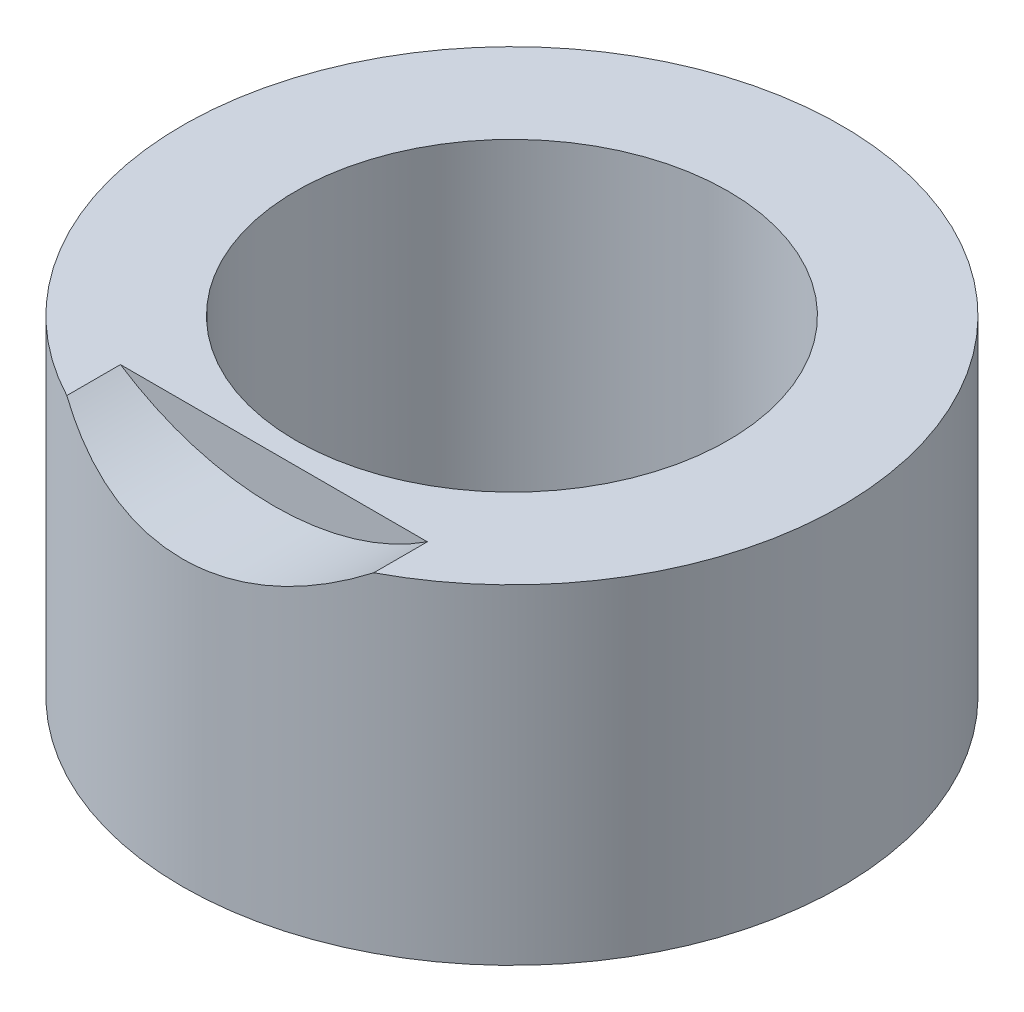
ISO-10303-21;
HEADER;
FILE_DESCRIPTION(('STEP AP214'),'2;1');
FILE_NAME('part.step','',(''),(''),'','','');
FILE_SCHEMA(('AUTOMOTIVE_DESIGN { 1 0 10303 214 1 1 1 1 }'));
ENDSEC;
DATA;
#1=APPLICATION_CONTEXT('core data for automotive mechanical design processes');
#2=APPLICATION_PROTOCOL_DEFINITION('international standard','automotive_design',2000,#1);
#3=PRODUCT_CONTEXT('',#1,'mechanical');
#4=PRODUCT('Part','Part','',(#3));
#5=PRODUCT_RELATED_PRODUCT_CATEGORY('part','',(#4));
#6=PRODUCT_DEFINITION_FORMATION('','',#4);
#7=PRODUCT_DEFINITION_CONTEXT('part definition',#1,'design');
#8=PRODUCT_DEFINITION('design','',#6,#7);
#9=PRODUCT_DEFINITION_SHAPE('','',#8);
#10=(LENGTH_UNIT() NAMED_UNIT(*) SI_UNIT(.MILLI.,.METRE.));
#11=(NAMED_UNIT(*) PLANE_ANGLE_UNIT() SI_UNIT($,.RADIAN.));
#12=(NAMED_UNIT(*) SI_UNIT($,.STERADIAN.) SOLID_ANGLE_UNIT());
#13=UNCERTAINTY_MEASURE_WITH_UNIT(LENGTH_MEASURE(1.E-05),#10,'distance_accuracy_value','');
#14=(GEOMETRIC_REPRESENTATION_CONTEXT(3) GLOBAL_UNCERTAINTY_ASSIGNED_CONTEXT((#13)) GLOBAL_UNIT_ASSIGNED_CONTEXT((#10,
#11,#12)) REPRESENTATION_CONTEXT('',''));
#15=CARTESIAN_POINT('',(0.,0.,0.));
#16=DIRECTION('',(0.,0.,1.));
#17=DIRECTION('',(1.,0.,0.));
#18=AXIS2_PLACEMENT_3D('',#15,#16,#17);
#19=CARTESIAN_POINT('',(0.,-23.8,0.));
#20=DIRECTION('',(0.,1.,0.));
#21=DIRECTION('',(0.,0.,1.));
#22=AXIS2_PLACEMENT_3D('',#19,#20,#21);
#23=CYLINDRICAL_SURFACE('',#22,5.9);
#24=CARTESIAN_POINT('',(0.,-14.8,0.));
#25=DIRECTION('',(0.,-1.,0.));
#26=DIRECTION('',(0.,0.,-1.));
#27=AXIS2_PLACEMENT_3D('',#24,#25,#26);
#28=CIRCLE('',#27,5.9);
#29=CARTESIAN_POINT('',(0.,-14.8,-5.9));
#30=VERTEX_POINT('',#29);
#31=EDGE_CURVE('E74',#30,#30,#28,.F.);
#32=ORIENTED_EDGE('',*,*,#31,.T.);
#33=EDGE_LOOP('',(#32));
#34=FACE_BOUND('',#33,.T.);
#35=CARTESIAN_POINT('',(0.,-23.8,0.));
#36=DIRECTION('',(0.,1.,0.));
#37=DIRECTION('',(0.,0.,1.));
#38=AXIS2_PLACEMENT_3D('',#35,#36,#37);
#39=CIRCLE('',#38,5.9);
#40=CARTESIAN_POINT('',(0.,-23.8,5.9));
#41=VERTEX_POINT('',#40);
#42=EDGE_CURVE('E73',#41,#41,#39,.T.);
#43=ORIENTED_EDGE('',*,*,#42,.F.);
#44=EDGE_LOOP('',(#43));
#45=FACE_BOUND('',#44,.T.);
#46=ADVANCED_FACE('F35',(#34,#45),#23,.F.);
#47=CARTESIAN_POINT('',(0.,-23.8,0.));
#48=DIRECTION('',(0.,1.,0.));
#49=DIRECTION('',(0.,0.,1.));
#50=AXIS2_PLACEMENT_3D('',#47,#48,#49);
#51=CYLINDRICAL_SURFACE('',#50,9.);
#52=CARTESIAN_POINT('',(0.,-14.8,0.));
#53=DIRECTION('',(0.,-1.,0.));
#54=DIRECTION('',(0.,0.,-1.));
#55=AXIS2_PLACEMENT_3D('',#52,#53,#54);
#56=CIRCLE('',#55,9.);
#57=CARTESIAN_POINT('',(4.19076365356005,-14.8,7.96476616103699));
#58=VERTEX_POINT('',#57);
#59=CARTESIAN_POINT('',(-4.19076365356005,-14.8,7.96476616103699));
#60=VERTEX_POINT('',#59);
#61=EDGE_CURVE('E55',#58,#60,#56,.F.);
#62=ORIENTED_EDGE('',*,*,#61,.F.);
#63=CARTESIAN_POINT('',(6.22494979899437,-12.8466279358633,6.5));
#64=CARTESIAN_POINT('',(6.16134895331716,-12.9356573347165,6.56091095855703));
#65=CARTESIAN_POINT('',(6.0958583891841,-13.0233080996715,6.62183887781584));
#66=CARTESIAN_POINT('',(5.96107696732273,-13.1958378176106,6.74342617047551));
#67=CARTESIAN_POINT('',(5.89178593952,-13.2807166462761,6.80408553172665));
#68=CARTESIAN_POINT('',(5.6780312028604,-13.5313474378074,6.98533319888477));
#69=CARTESIAN_POINT('',(5.52782731561726,-13.6928954535369,7.10505415115098));
#70=CARTESIAN_POINT('',(5.21080152474896,-14.005354596473,7.34077063418253));
#71=CARTESIAN_POINT('',(5.04385000619752,-14.1561643852392,7.45672617039017));
#72=CARTESIAN_POINT('',(4.69446487048112,-14.4444806569503,7.68147793110335));
#73=CARTESIAN_POINT('',(4.51203985859151,-14.5819944443157,7.7902780759357));
#74=CARTESIAN_POINT('',(4.17266754314741,-14.8143660023857,7.97607880809));
#75=CARTESIAN_POINT('',(4.01864288156205,-14.9120482422694,8.05489611536718));
#76=CARTESIAN_POINT('',(3.70143650603726,-15.0974322265121,8.20549669217374));
#77=CARTESIAN_POINT('',(3.53825692165807,-15.1851362776799,8.2772815869569));
#78=CARTESIAN_POINT('',(3.20361752687017,-15.3493869824871,8.41244966201882));
#79=CARTESIAN_POINT('',(3.03218060895157,-15.4259623579903,8.47585443068598));
#80=CARTESIAN_POINT('',(2.68133955596,-15.5671939972859,8.59328987490824));
#81=CARTESIAN_POINT('',(2.50193544079964,-15.6318502908659,8.64732057389052));
#82=CARTESIAN_POINT('',(2.13427287057132,-15.7488073167802,8.74536685942876));
#83=CARTESIAN_POINT('',(1.94594195795109,-15.8009731540457,8.78927292941695));
#84=CARTESIAN_POINT('',(1.56355401054903,-15.8910864095939,8.86528563337414));
#85=CARTESIAN_POINT('',(1.36949690894912,-15.9290336618911,8.89739212959674));
#86=CARTESIAN_POINT('',(0.977429764550203,-15.9898927283797,8.94895021819504));
#87=CARTESIAN_POINT('',(0.779420942388701,-16.0128091135596,8.96840565782732));
#88=CARTESIAN_POINT('',(0.381378050919115,-16.0430928821558,8.99412605970429));
#89=CARTESIAN_POINT('',(0.18134431242902,-16.0504627655448,9.00039314271708));
#90=CARTESIAN_POINT('',(-0.189066377481256,-16.0495635700107,8.99962921178908));
#91=CARTESIAN_POINT('',(-0.359458469906311,-16.0434442171736,8.99442614210154));
#92=CARTESIAN_POINT('',(-0.698894301640698,-16.0199069683063,8.97443273684066));
#93=CARTESIAN_POINT('',(-0.867938069175351,-16.0024893094224,8.95964260249531));
#94=CARTESIAN_POINT('',(-1.20339446308161,-15.9566525378765,8.92078193229801));
#95=CARTESIAN_POINT('',(-1.36980771031539,-15.92823606279,8.89671362140832));
#96=CARTESIAN_POINT('',(-1.69894301858588,-15.8608522672049,8.83976768026059));
#97=CARTESIAN_POINT('',(-1.86166493136956,-15.8218845237518,8.80688969686156));
#98=CARTESIAN_POINT('',(-2.18009147646861,-15.7346127353515,8.73346979960461));
#99=CARTESIAN_POINT('',(-2.3358643691624,-15.6864556286855,8.69304869920528));
#100=CARTESIAN_POINT('',(-2.64218608000161,-15.5810601824322,8.60489955335281));
#101=CARTESIAN_POINT('',(-2.79273339189256,-15.5238192505269,8.55716942220446));
#102=CARTESIAN_POINT('',(-3.23578128588798,-15.3393405782271,8.40399931712716));
#103=CARTESIAN_POINT('',(-3.51969595571953,-15.1993446888619,8.28857770319577));
#104=CARTESIAN_POINT('',(-3.98506215597237,-14.9339263778713,8.07251847286217));
#105=CARTESIAN_POINT('',(-4.17292265529351,-14.8154236495986,7.97680959678669));
#106=CARTESIAN_POINT('',(-4.5346885239896,-14.5650178190244,7.77684101325969));
#107=CARTESIAN_POINT('',(-4.70859308347794,-14.4331139400366,7.67258081026922));
#108=CARTESIAN_POINT('',(-5.04227965073812,-14.1571566666687,7.45753752933202));
#109=CARTESIAN_POINT('',(-5.20205301436366,-14.0130959397067,7.34675052698657));
#110=CARTESIAN_POINT('',(-5.50731642037851,-13.7139075986003,7.120778852295));
#111=CARTESIAN_POINT('',(-5.65281316717223,-13.5587852387511,7.0055962797801));
#112=CARTESIAN_POINT('',(-5.86795324223616,-13.3095235770394,6.82474781071757));
#113=CARTESIAN_POINT('',(-5.94251443298016,-13.2190007102533,6.759880633005));
#114=CARTESIAN_POINT('',(-6.08707590851366,-13.0350437410749,6.63000197691167));
#115=CARTESIAN_POINT('',(-6.15708892627183,-12.9416189537575,6.56499147943313));
#116=CARTESIAN_POINT('',(-6.22494979899437,-12.8466279358633,6.5));
#117=B_SPLINE_CURVE_WITH_KNOTS('',3,(#63,#64,#65,#66,#67,#68,#69,#70,#71,#72,#73,#74,#75,#76,
#77,#78,#79,#80,#81,#82,#83,#84,#85,#86,#87,#88,#89,#90,#91,#92,#93,#94,#95,#96,#97,#98,#99,
#100,#101,#102,#103,#104,#105,#106,#107,#108,#109,#110,#111,#112,#113,#114,#115,#116),
.UNSPECIFIED.,.F.,.F.,(4,2,2,2,2,2,2,2,2,2,2,2,2,2,2,2,2,2,2,2,2,2,2,2,2,2,4),(0.,
0.375629926240318,0.751276676017924,1.50340626062359,2.26188693980813,3.01994853649186,
3.61548939535621,4.21089229306136,4.80473014126492,5.39856650535911,5.99855292937193,
6.59854635731137,7.19835723847894,7.79807165902936,8.30918030462657,8.82027822264028,
9.33125365248253,9.84224956814612,10.3456717589664,10.8492378742921,11.8563443800742,
12.5810734304056,13.305844507613,14.0310559093185,14.7559250999285,15.1578912178923,
15.5586786379522),.UNSPECIFIED.);
#118=EDGE_CURVE('E44',#58,#60,#117,.T.);
#119=ORIENTED_EDGE('',*,*,#118,.T.);
#120=EDGE_LOOP('',(#62,#119));
#121=FACE_BOUND('',#120,.T.);
#122=CARTESIAN_POINT('',(0.,-23.8,0.));
#123=DIRECTION('',(0.,1.,0.));
#124=DIRECTION('',(0.,0.,1.));
#125=AXIS2_PLACEMENT_3D('',#122,#123,#124);
#126=CIRCLE('',#125,9.);
#127=CARTESIAN_POINT('',(0.,-23.8,9.));
#128=VERTEX_POINT('',#127);
#129=EDGE_CURVE('E77',#128,#128,#126,.T.);
#130=ORIENTED_EDGE('',*,*,#129,.T.);
#131=EDGE_LOOP('',(#130));
#132=FACE_BOUND('',#131,.T.);
#133=ADVANCED_FACE('F37',(#121,#132),#51,.T.);
#134=CARTESIAN_POINT('',(0.,-23.8,0.));
#135=DIRECTION('',(0.,1.,0.));
#136=DIRECTION('',(0.,0.,1.));
#137=AXIS2_PLACEMENT_3D('',#134,#135,#136);
#138=PLANE('',#137);
#139=ORIENTED_EDGE('',*,*,#42,.T.);
#140=EDGE_LOOP('',(#139));
#141=FACE_BOUND('',#140,.T.);
#142=ORIENTED_EDGE('',*,*,#129,.F.);
#143=EDGE_LOOP('',(#142));
#144=FACE_BOUND('',#143,.T.);
#145=ADVANCED_FACE('F93',(#141,#144),#138,.F.);
#146=CARTESIAN_POINT('',(0.,-8.4,9.));
#147=DIRECTION('',(0.,0.,-1.));
#148=DIRECTION('',(-1.,0.,0.));
#149=AXIS2_PLACEMENT_3D('',#146,#147,#148);
#150=CYLINDRICAL_SURFACE('',#149,7.65);
#151=DIRECTION('',(0.,0.,-1.));
#152=VECTOR('',#151,1.);
#153=CARTESIAN_POINT('',(-4.19076365356005,-14.8,9.));
#154=LINE('',#153,#152);
#155=CARTESIAN_POINT('',(-4.19076365356005,-14.8,6.5));
#156=VERTEX_POINT('',#155);
#157=EDGE_CURVE('E50',#60,#156,#154,.T.);
#158=ORIENTED_EDGE('',*,*,#157,.F.);
#159=ORIENTED_EDGE('',*,*,#118,.F.);
#160=DIRECTION('',(0.,0.,-1.));
#161=VECTOR('',#160,1.);
#162=CARTESIAN_POINT('',(4.19076365356005,-14.8,9.));
#163=LINE('',#162,#161);
#164=CARTESIAN_POINT('',(4.19076365356005,-14.8,6.5));
#165=VERTEX_POINT('',#164);
#166=EDGE_CURVE('E62',#165,#58,#163,.F.);
#167=ORIENTED_EDGE('',*,*,#166,.F.);
#168=CARTESIAN_POINT('',(0.,-8.4,6.5));
#169=DIRECTION('',(0.,0.,1.));
#170=DIRECTION('',(1.,0.,0.));
#171=AXIS2_PLACEMENT_3D('',#168,#169,#170);
#172=CIRCLE('',#171,7.65);
#173=EDGE_CURVE('E69',#156,#165,#172,.T.);
#174=ORIENTED_EDGE('',*,*,#173,.F.);
#175=EDGE_LOOP('',(#158,#159,#167,#174));
#176=FACE_BOUND('',#175,.T.);
#177=ADVANCED_FACE('F68',(#176),#150,.F.);
#178=CARTESIAN_POINT('',(0.,-8.4,6.5));
#179=DIRECTION('',(0.,0.,1.));
#180=DIRECTION('',(1.,0.,0.));
#181=AXIS2_PLACEMENT_3D('',#178,#179,#180);
#182=PLANE('',#181);
#183=DIRECTION('',(1.,0.,0.));
#184=VECTOR('',#183,1.);
#185=CARTESIAN_POINT('',(0.,-14.8,6.5));
#186=LINE('',#185,#184);
#187=EDGE_CURVE('E12',#156,#165,#186,.T.);
#188=ORIENTED_EDGE('',*,*,#187,.F.);
#189=ORIENTED_EDGE('',*,*,#173,.T.);
#190=EDGE_LOOP('',(#188,#189));
#191=FACE_BOUND('',#190,.T.);
#192=ADVANCED_FACE('F72',(#191),#182,.T.);
#193=CARTESIAN_POINT('',(0.,-14.8,0.));
#194=DIRECTION('',(0.,-1.,0.));
#195=DIRECTION('',(0.,0.,-1.));
#196=AXIS2_PLACEMENT_3D('',#193,#194,#195);
#197=PLANE('',#196);
#198=ORIENTED_EDGE('',*,*,#61,.T.);
#199=ORIENTED_EDGE('',*,*,#157,.T.);
#200=ORIENTED_EDGE('',*,*,#187,.T.);
#201=ORIENTED_EDGE('',*,*,#166,.T.);
#202=EDGE_LOOP('',(#198,#199,#200,#201));
#203=FACE_BOUND('',#202,.T.);
#204=ORIENTED_EDGE('',*,*,#31,.F.);
#205=EDGE_LOOP('',(#204));
#206=FACE_BOUND('',#205,.T.);
#207=ADVANCED_FACE('F60',(#203,#206),#197,.F.);
#208=CLOSED_SHELL('',(#46,#133,#145,#177,#192,#207));
#209=MANIFOLD_SOLID_BREP('B2',#208);
#210=ADVANCED_BREP_SHAPE_REPRESENTATION('',(#18,#209),#14);
#211=SHAPE_DEFINITION_REPRESENTATION(#9,#210);
ENDSEC;
END-ISO-10303-21;
